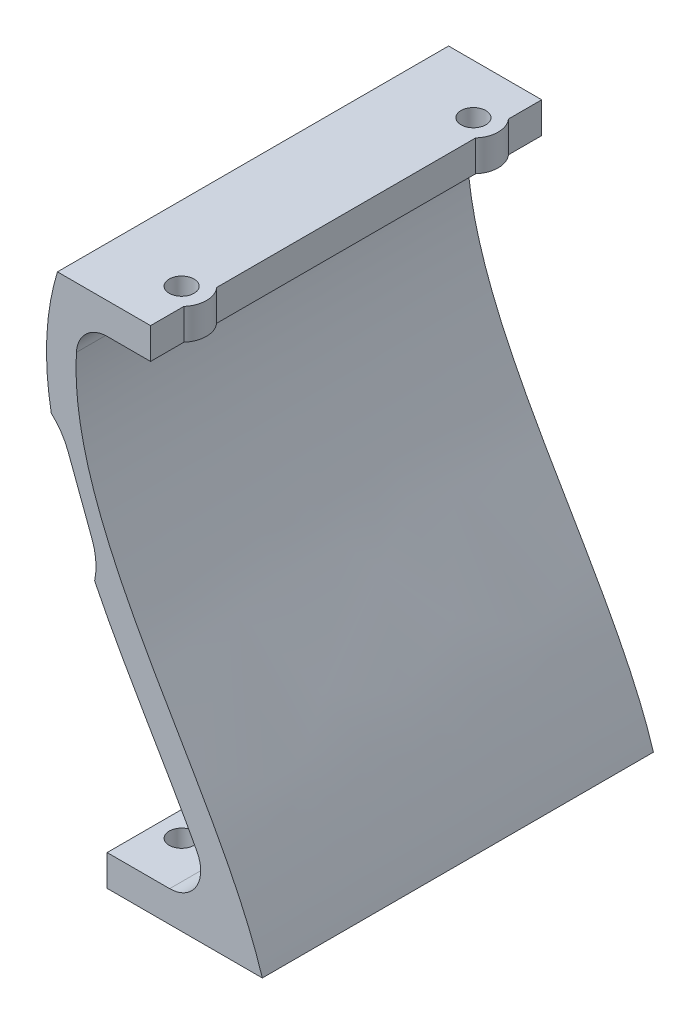
ISO-10303-21;
HEADER;
FILE_DESCRIPTION(('STEP AP214'),'2;1');
FILE_NAME('part.step','',(''),(''),'','','');
FILE_SCHEMA(('AUTOMOTIVE_DESIGN { 1 0 10303 214 1 1 1 1 }'));
ENDSEC;
DATA;
#1=APPLICATION_CONTEXT('core data for automotive mechanical design processes');
#2=APPLICATION_PROTOCOL_DEFINITION('international standard','automotive_design',2000,#1);
#3=PRODUCT_CONTEXT('',#1,'mechanical');
#4=PRODUCT('Part','Part','',(#3));
#5=PRODUCT_RELATED_PRODUCT_CATEGORY('part','',(#4));
#6=PRODUCT_DEFINITION_FORMATION('','',#4);
#7=PRODUCT_DEFINITION_CONTEXT('part definition',#1,'design');
#8=PRODUCT_DEFINITION('design','',#6,#7);
#9=PRODUCT_DEFINITION_SHAPE('','',#8);
#10=(LENGTH_UNIT() NAMED_UNIT(*) SI_UNIT(.MILLI.,.METRE.));
#11=(NAMED_UNIT(*) PLANE_ANGLE_UNIT() SI_UNIT($,.RADIAN.));
#12=(NAMED_UNIT(*) SI_UNIT($,.STERADIAN.) SOLID_ANGLE_UNIT());
#13=UNCERTAINTY_MEASURE_WITH_UNIT(LENGTH_MEASURE(1.E-05),#10,'distance_accuracy_value','');
#14=(GEOMETRIC_REPRESENTATION_CONTEXT(3) GLOBAL_UNCERTAINTY_ASSIGNED_CONTEXT((#13)) GLOBAL_UNIT_ASSIGNED_CONTEXT((#10,
#11,#12)) REPRESENTATION_CONTEXT('',''));
#15=CARTESIAN_POINT('',(0.,0.,0.));
#16=DIRECTION('',(0.,0.,1.));
#17=DIRECTION('',(1.,0.,0.));
#18=AXIS2_PLACEMENT_3D('',#15,#16,#17);
#19=CARTESIAN_POINT('',(-22.5334776197952,22.7570781612548,63.));
#20=CARTESIAN_POINT('',(-22.8802638174594,21.7643013859488,63.));
#21=CARTESIAN_POINT('',(-23.5022218297949,19.7353540922829,63.));
#22=CARTESIAN_POINT('',(-24.3984566732412,15.7227335791878,63.));
#23=CARTESIAN_POINT('',(-24.9259424602794,10.7154717202631,63.));
#24=CARTESIAN_POINT('',(-24.7059244457818,4.80639957244901,63.));
#25=CARTESIAN_POINT('',(-23.4437954980132,-2.90791828688786,63.));
#26=CARTESIAN_POINT('',(-20.3649701079,-12.2138739410152,63.));
#27=CARTESIAN_POINT('',(-15.1627192062184,-22.9267758821705,63.));
#28=CARTESIAN_POINT('',(-9.22446854976525,-33.2839412268649,63.));
#29=CARTESIAN_POINT('',(-4.2731817504284,-41.6523064711653,63.));
#30=CARTESIAN_POINT('',(-0.670405229165687,-48.1782991582584,63.));
#31=CARTESIAN_POINT('',(1.76514247549924,-52.980809675903,63.));
#32=CARTESIAN_POINT('',(3.49961876568494,-56.8892897902748,63.));
#33=CARTESIAN_POINT('',(4.67496429136453,-59.9655632013083,63.));
#34=CARTESIAN_POINT('',(5.17847746688474,-61.4613851443489,63.));
#35=CARTESIAN_POINT('',(5.41540171981831,-62.2227851308582,63.));
#36=B_SPLINE_CURVE_WITH_KNOTS('',3,(#19,#20,#21,#22,#23,#24,#25,#26,#27,#28,#29,#30,#31,#32,#33,
#34,#35),.UNSPECIFIED.,.F.,.F.,(4,1,1,1,1,1,1,1,1,1,1,1,1,1,4),(0.,0.03125,0.0625,0.125,0.1875,
0.25,0.375,0.5,0.625,0.75,0.8125,0.875,0.9375,0.96875,1.),.UNSPECIFIED.);
#37=DIRECTION('',(0.,0.,-1.));
#38=VECTOR('',#37,1.);
#39=SURFACE_OF_LINEAR_EXTRUSION('',#36,#38);
#40=CARTESIAN_POINT('',(-22.5334776197952,22.7570781612548,0.));
#41=CARTESIAN_POINT('',(-22.8802638174594,21.7643013859488,0.));
#42=CARTESIAN_POINT('',(-23.5022218297949,19.7353540922829,0.));
#43=CARTESIAN_POINT('',(-24.3984566732412,15.7227335791878,0.));
#44=CARTESIAN_POINT('',(-24.9259424602794,10.7154717202631,0.));
#45=CARTESIAN_POINT('',(-24.7059244457818,4.80639957244901,0.));
#46=CARTESIAN_POINT('',(-23.4437954980132,-2.90791828688786,0.));
#47=CARTESIAN_POINT('',(-20.3649701079,-12.2138739410152,0.));
#48=CARTESIAN_POINT('',(-15.1627192062184,-22.9267758821705,0.));
#49=CARTESIAN_POINT('',(-9.22446854976525,-33.2839412268649,0.));
#50=CARTESIAN_POINT('',(-4.2731817504284,-41.6523064711653,0.));
#51=CARTESIAN_POINT('',(-0.670405229165687,-48.1782991582584,0.));
#52=CARTESIAN_POINT('',(1.76514247549924,-52.980809675903,0.));
#53=CARTESIAN_POINT('',(3.49961876568494,-56.8892897902748,0.));
#54=CARTESIAN_POINT('',(4.67496429136453,-59.9655632013083,0.));
#55=CARTESIAN_POINT('',(5.17847746688474,-61.4613851443489,0.));
#56=CARTESIAN_POINT('',(5.41540171981831,-62.2227851308582,0.));
#57=B_SPLINE_CURVE_WITH_KNOTS('',3,(#40,#41,#42,#43,#44,#45,#46,#47,#48,#49,#50,#51,#52,#53,#54,
#55,#56),.UNSPECIFIED.,.F.,.F.,(4,1,1,1,1,1,1,1,1,1,1,1,1,1,4),(0.,0.03125,0.0625,0.125,0.1875,
0.25,0.375,0.5,0.625,0.75,0.8125,0.875,0.9375,0.96875,1.),.UNSPECIFIED.);
#58=CARTESIAN_POINT('',(-23.0458869966733,21.1895240179298,0.));
#59=VERTEX_POINT('',#58);
#60=CARTESIAN_POINT('',(-24.0422868679237,0.965333873783401,0.));
#61=VERTEX_POINT('',#60);
#62=EDGE_CURVE('E182',#59,#61,#57,.T.);
#63=ORIENTED_EDGE('',*,*,#62,.T.);
#64=DIRECTION('',(0.,0.,-1.));
#65=VECTOR('',#64,1.);
#66=CARTESIAN_POINT('',(-24.0422868687584,0.965333873300134,63.));
#67=LINE('',#66,#65);
#68=CARTESIAN_POINT('',(-24.0422868679237,0.965333873783399,63.));
#69=VERTEX_POINT('',#68);
#70=EDGE_CURVE('E174',#61,#69,#67,.F.);
#71=ORIENTED_EDGE('',*,*,#70,.T.);
#72=CARTESIAN_POINT('',(-23.0458869966733,21.1895240179298,63.));
#73=VERTEX_POINT('',#72);
#74=EDGE_CURVE('E219',#73,#69,#36,.T.);
#75=ORIENTED_EDGE('',*,*,#74,.F.);
#76=DIRECTION('',(0.,0.,-1.));
#77=VECTOR('',#76,1.);
#78=CARTESIAN_POINT('',(-23.0458869966733,21.1895240179298,63.));
#79=LINE('',#78,#77);
#80=EDGE_CURVE('E201',#73,#59,#79,.T.);
#81=ORIENTED_EDGE('',*,*,#80,.T.);
#82=EDGE_LOOP('',(#63,#71,#75,#81));
#83=FACE_BOUND('',#82,.T.);
#84=ADVANCED_FACE('F33',(#83),#39,.F.);
#85=CARTESIAN_POINT('',(-8.04588699669594,16.1895240178556,63.));
#86=DIRECTION('',(1.,0.,0.));
#87=DIRECTION('',(0.,0.,-1.));
#88=AXIS2_PLACEMENT_3D('',#85,#86,#87);
#89=PLANE('',#88);
#90=DIRECTION('',(0.,-1.,0.));
#91=VECTOR('',#90,1.);
#92=CARTESIAN_POINT('',(-8.04588699669594,21.1895240178556,10.6457513110646));
#93=LINE('',#92,#91);
#94=CARTESIAN_POINT('',(-8.04588699669594,21.1895240178556,10.6457513110646));
#95=VERTEX_POINT('',#94);
#96=CARTESIAN_POINT('',(-8.04588699669594,16.1895240178556,10.6457513110646));
#97=VERTEX_POINT('',#96);
#98=EDGE_CURVE('E291',#95,#97,#93,.T.);
#99=ORIENTED_EDGE('',*,*,#98,.F.);
#100=DIRECTION('',(0.,0.,-1.));
#101=VECTOR('',#100,1.);
#102=CARTESIAN_POINT('',(-8.04588699669594,21.1895240178556,63.));
#103=LINE('',#102,#101);
#104=CARTESIAN_POINT('',(-8.04588699669594,21.1895240178556,52.3542486889354));
#105=VERTEX_POINT('',#104);
#106=EDGE_CURVE('E265',#105,#95,#103,.T.);
#107=ORIENTED_EDGE('',*,*,#106,.F.);
#108=DIRECTION('',(0.,-1.,0.));
#109=VECTOR('',#108,1.);
#110=CARTESIAN_POINT('',(-8.04588699669594,21.1895240178556,52.3542486889354));
#111=LINE('',#110,#109);
#112=CARTESIAN_POINT('',(-8.04588699669594,16.1895240178556,52.3542486889354));
#113=VERTEX_POINT('',#112);
#114=EDGE_CURVE('E284',#113,#105,#111,.F.);
#115=ORIENTED_EDGE('',*,*,#114,.F.);
#116=DIRECTION('',(0.,0.,-1.));
#117=VECTOR('',#116,1.);
#118=CARTESIAN_POINT('',(-8.04588699669594,16.1895240178556,63.));
#119=LINE('',#118,#117);
#120=EDGE_CURVE('E268',#113,#97,#119,.T.);
#121=ORIENTED_EDGE('',*,*,#120,.T.);
#122=EDGE_LOOP('',(#99,#107,#115,#121));
#123=FACE_BOUND('',#122,.T.);
#124=ADVANCED_FACE('F415',(#123),#89,.T.);
#125=DIRECTION('',(0.,-1.,0.));
#126=VECTOR('',#125,1.);
#127=CARTESIAN_POINT('',(-8.04588699669594,21.1895240178556,57.6457513110646));
#128=LINE('',#127,#126);
#129=CARTESIAN_POINT('',(-8.04588699669594,21.1895240178556,57.6457513110646));
#130=VERTEX_POINT('',#129);
#131=CARTESIAN_POINT('',(-8.04588699669594,16.1895240178556,57.6457513110646));
#132=VERTEX_POINT('',#131);
#133=EDGE_CURVE('E279',#130,#132,#128,.T.);
#134=ORIENTED_EDGE('',*,*,#133,.F.);
#135=CARTESIAN_POINT('',(-8.04588699669594,21.1895240178556,63.));
#136=VERTEX_POINT('',#135);
#137=EDGE_CURVE('E261',#136,#130,#103,.T.);
#138=ORIENTED_EDGE('',*,*,#137,.F.);
#139=DIRECTION('',(0.,1.,0.));
#140=VECTOR('',#139,1.);
#141=CARTESIAN_POINT('',(-8.04588699669594,16.1895240178556,63.));
#142=LINE('',#141,#140);
#143=CARTESIAN_POINT('',(-8.04588699669594,16.1895240178556,63.));
#144=VERTEX_POINT('',#143);
#145=EDGE_CURVE('E249',#144,#136,#142,.T.);
#146=ORIENTED_EDGE('',*,*,#145,.F.);
#147=EDGE_CURVE('E257',#144,#132,#119,.T.);
#148=ORIENTED_EDGE('',*,*,#147,.T.);
#149=EDGE_LOOP('',(#134,#138,#146,#148));
#150=FACE_BOUND('',#149,.T.);
#151=ADVANCED_FACE('F241',(#150),#89,.T.);
#152=CARTESIAN_POINT('',(9.95411300330407,-60.8104759821444,63.));
#153=CARTESIAN_POINT('',(1.78782004145555,-34.5665002552168,63.));
#154=CARTESIAN_POINT('',(-27.9913048539535,-7.28206006884536,63.));
#155=CARTESIAN_POINT('',(-18.0458869966959,21.1895240178556,63.));
#156=B_SPLINE_CURVE_WITH_KNOTS('',3,(#152,#153,#154,#155),.UNSPECIFIED.,.F.,.F.,(4,4),(0.,1.),.UNSPECIFIED.);
#157=DIRECTION('',(0.,0.,-1.));
#158=VECTOR('',#157,1.);
#159=SURFACE_OF_LINEAR_EXTRUSION('',#156,#158);
#160=CARTESIAN_POINT('',(9.95411300330407,-60.8104759821444,0.));
#161=CARTESIAN_POINT('',(1.78782004145555,-34.5665002552168,0.));
#162=CARTESIAN_POINT('',(-27.9913048539535,-7.28206006884536,0.));
#163=CARTESIAN_POINT('',(-18.0458869966959,21.1895240178556,0.));
#164=B_SPLINE_CURVE_WITH_KNOTS('',3,(#160,#161,#162,#163),.UNSPECIFIED.,.F.,.F.,(4,4),(0.,1.),.UNSPECIFIED.);
#165=CARTESIAN_POINT('',(9.95411300330406,-60.8104759821444,0.));
#166=VERTEX_POINT('',#165);
#167=CARTESIAN_POINT('',(-19.9900394366485,11.486126685123,0.));
#168=VERTEX_POINT('',#167);
#169=EDGE_CURVE('E187',#166,#168,#164,.T.);
#170=ORIENTED_EDGE('',*,*,#169,.T.);
#171=DIRECTION('',(0.,0.,-1.));
#172=VECTOR('',#171,1.);
#173=CARTESIAN_POINT('',(-19.9900394366485,11.486126685123,0.));
#174=LINE('',#173,#172);
#175=CARTESIAN_POINT('',(-19.9900394366485,11.486126685123,63.));
#176=VERTEX_POINT('',#175);
#177=EDGE_CURVE('E205',#168,#176,#174,.F.);
#178=ORIENTED_EDGE('',*,*,#177,.T.);
#179=CARTESIAN_POINT('',(9.95411300330406,-60.8104759821444,63.));
#180=VERTEX_POINT('',#179);
#181=EDGE_CURVE('E197',#180,#176,#156,.T.);
#182=ORIENTED_EDGE('',*,*,#181,.F.);
#183=DIRECTION('',(0.,0.,-1.));
#184=VECTOR('',#183,1.);
#185=CARTESIAN_POINT('',(9.95411300330406,-60.8104759821444,63.));
#186=LINE('',#185,#184);
#187=EDGE_CURVE('E198',#180,#166,#186,.T.);
#188=ORIENTED_EDGE('',*,*,#187,.T.);
#189=EDGE_LOOP('',(#170,#178,#182,#188));
#190=FACE_BOUND('',#189,.T.);
#191=ADVANCED_FACE('F237',(#190),#159,.F.);
#192=CARTESIAN_POINT('',(-18.0458869966959,21.1895240178556,63.));
#193=DIRECTION('',(0.,-1.,0.));
#194=DIRECTION('',(0.,0.,-1.));
#195=AXIS2_PLACEMENT_3D('',#192,#193,#194);
#196=PLANE('',#195);
#197=ORIENTED_EDGE('',*,*,#106,.T.);
#198=CARTESIAN_POINT('',(-11.0458869966959,21.1895240178556,8.));
#199=DIRECTION('',(0.,-1.,0.));
#200=DIRECTION('',(1.,0.,0.));
#201=AXIS2_PLACEMENT_3D('',#198,#199,#200);
#202=CIRCLE('',#201,4.);
#203=CARTESIAN_POINT('',(-8.04588699669594,21.1895240178556,5.35424868893539));
#204=VERTEX_POINT('',#203);
#205=EDGE_CURVE('E299',#204,#95,#202,.T.);
#206=ORIENTED_EDGE('',*,*,#205,.F.);
#207=CARTESIAN_POINT('',(-8.04588699669594,21.1895240178556,0.));
#208=VERTEX_POINT('',#207);
#209=EDGE_CURVE('E266',#204,#208,#103,.T.);
#210=ORIENTED_EDGE('',*,*,#209,.T.);
#211=DIRECTION('',(-1.,0.,0.));
#212=VECTOR('',#211,1.);
#213=CARTESIAN_POINT('',(-18.0458869966959,21.1895240178556,0.));
#214=LINE('',#213,#212);
#215=EDGE_CURVE('E183',#208,#59,#214,.T.);
#216=ORIENTED_EDGE('',*,*,#215,.T.);
#217=ORIENTED_EDGE('',*,*,#80,.F.);
#218=DIRECTION('',(-1.,0.,0.));
#219=VECTOR('',#218,1.);
#220=CARTESIAN_POINT('',(-18.0458869966959,21.1895240178556,63.));
#221=LINE('',#220,#219);
#222=EDGE_CURVE('E224',#136,#73,#221,.T.);
#223=ORIENTED_EDGE('',*,*,#222,.F.);
#224=ORIENTED_EDGE('',*,*,#137,.T.);
#225=CARTESIAN_POINT('',(-11.0458869966959,21.1895240178556,55.));
#226=DIRECTION('',(0.,-1.,0.));
#227=DIRECTION('',(1.,0.,0.));
#228=AXIS2_PLACEMENT_3D('',#225,#226,#227);
#229=CIRCLE('',#228,4.);
#230=EDGE_CURVE('E287',#105,#130,#229,.T.);
#231=ORIENTED_EDGE('',*,*,#230,.F.);
#232=EDGE_LOOP('',(#197,#206,#210,#216,#217,#223,#224,#231));
#233=FACE_BOUND('',#232,.T.);
#234=CARTESIAN_POINT('',(-11.0458869966959,21.1895240178556,55.));
#235=DIRECTION('',(0.,-1.,0.));
#236=DIRECTION('',(0.,0.,-1.));
#237=AXIS2_PLACEMENT_3D('',#234,#235,#236);
#238=CIRCLE('',#237,2.);
#239=CARTESIAN_POINT('',(-11.0458869966959,21.1895240178556,53.));
#240=VERTEX_POINT('',#239);
#241=EDGE_CURVE('E272',#240,#240,#238,.T.);
#242=ORIENTED_EDGE('',*,*,#241,.T.);
#243=EDGE_LOOP('',(#242));
#244=FACE_BOUND('',#243,.T.);
#245=CARTESIAN_POINT('',(-11.0458869966959,21.1895240178556,8.));
#246=DIRECTION('',(0.,-1.,0.));
#247=DIRECTION('',(0.,0.,-1.));
#248=AXIS2_PLACEMENT_3D('',#245,#246,#247);
#249=CIRCLE('',#248,2.);
#250=CARTESIAN_POINT('',(-11.0458869966959,21.1895240178556,6.));
#251=VERTEX_POINT('',#250);
#252=EDGE_CURVE('E269',#251,#251,#249,.T.);
#253=ORIENTED_EDGE('',*,*,#252,.T.);
#254=EDGE_LOOP('',(#253));
#255=FACE_BOUND('',#254,.T.);
#256=ADVANCED_FACE('F233',(#233,#244,#255),#196,.F.);
#257=CARTESIAN_POINT('',(-17.056649455873,-18.9189032047106,63.));
#258=VERTEX_POINT('',#257);
#259=CARTESIAN_POINT('',(-0.547367076397627,-48.4799277852592,63.));
#260=VERTEX_POINT('',#259);
#261=EDGE_CURVE('E173',#258,#260,#36,.T.);
#262=ORIENTED_EDGE('',*,*,#261,.F.);
#263=DIRECTION('',(0.,0.,-1.));
#264=VECTOR('',#263,1.);
#265=CARTESIAN_POINT('',(-17.0566494558731,-18.9189032047107,63.));
#266=LINE('',#265,#264);
#267=CARTESIAN_POINT('',(-17.056649455873,-18.9189032047106,0.));
#268=VERTEX_POINT('',#267);
#269=EDGE_CURVE('E161',#258,#268,#266,.T.);
#270=ORIENTED_EDGE('',*,*,#269,.T.);
#271=CARTESIAN_POINT('',(-0.547367076397627,-48.4799277852592,0.));
#272=VERTEX_POINT('',#271);
#273=EDGE_CURVE('E171',#268,#272,#57,.T.);
#274=ORIENTED_EDGE('',*,*,#273,.T.);
#275=DIRECTION('',(0.,0.,-1.));
#276=VECTOR('',#275,1.);
#277=CARTESIAN_POINT('',(-0.547367076397627,-48.4799277852592,0.));
#278=LINE('',#277,#276);
#279=EDGE_CURVE('E364',#272,#260,#278,.F.);
#280=ORIENTED_EDGE('',*,*,#279,.T.);
#281=EDGE_LOOP('',(#262,#270,#274,#280));
#282=FACE_BOUND('',#281,.T.);
#283=ADVANCED_FACE('F169',(#282),#39,.F.);
#284=CARTESIAN_POINT('',(9.95411300330406,-60.8104759821444,63.));
#285=DIRECTION('',(0.,1.,0.));
#286=DIRECTION('',(0.,0.,1.));
#287=AXIS2_PLACEMENT_3D('',#284,#285,#286);
#288=PLANE('',#287);
#289=CARTESIAN_POINT('',(-11.045886996696,-60.8104759821444,54.9999999999997));
#290=DIRECTION('',(0.,1.,0.));
#291=DIRECTION('',(0.,0.,1.));
#292=AXIS2_PLACEMENT_3D('',#289,#290,#291);
#293=CIRCLE('',#292,1.99999999999999);
#294=CARTESIAN_POINT('',(-11.045886996696,-60.8104759821444,56.9999999999997));
#295=VERTEX_POINT('',#294);
#296=EDGE_CURVE('E316',#295,#295,#293,.T.);
#297=ORIENTED_EDGE('',*,*,#296,.T.);
#298=EDGE_LOOP('',(#297));
#299=FACE_BOUND('',#298,.T.);
#300=CARTESIAN_POINT('',(-11.045886996696,-60.8104759821444,8.00000000000028));
#301=DIRECTION('',(0.,1.,0.));
#302=DIRECTION('',(0.,0.,-1.));
#303=AXIS2_PLACEMENT_3D('',#300,#301,#302);
#304=CIRCLE('',#303,1.99999999999999);
#305=CARTESIAN_POINT('',(-11.045886996696,-60.8104759821444,6.00000000000029));
#306=VERTEX_POINT('',#305);
#307=EDGE_CURVE('E325',#306,#306,#304,.T.);
#308=ORIENTED_EDGE('',*,*,#307,.T.);
#309=EDGE_LOOP('',(#308));
#310=FACE_BOUND('',#309,.T.);
#311=DIRECTION('',(1.,0.,0.));
#312=VECTOR('',#311,1.);
#313=CARTESIAN_POINT('',(9.95411300330406,-60.8104759821444,0.));
#314=LINE('',#313,#312);
#315=CARTESIAN_POINT('',(-15.0458869966959,-60.8104759821444,0.));
#316=VERTEX_POINT('',#315);
#317=EDGE_CURVE('E186',#316,#166,#314,.T.);
#318=ORIENTED_EDGE('',*,*,#317,.T.);
#319=ORIENTED_EDGE('',*,*,#187,.F.);
#320=DIRECTION('',(1.,0.,0.));
#321=VECTOR('',#320,1.);
#322=CARTESIAN_POINT('',(9.95411300330406,-60.8104759821444,63.));
#323=LINE('',#322,#321);
#324=CARTESIAN_POINT('',(-15.0458869966959,-60.8104759821444,63.));
#325=VERTEX_POINT('',#324);
#326=EDGE_CURVE('E202',#325,#180,#323,.T.);
#327=ORIENTED_EDGE('',*,*,#326,.F.);
#328=DIRECTION('',(0.,0.,-1.));
#329=VECTOR('',#328,1.);
#330=CARTESIAN_POINT('',(-15.0458869966959,-60.8104759821444,63.));
#331=LINE('',#330,#329);
#332=EDGE_CURVE('E312',#325,#316,#331,.T.);
#333=ORIENTED_EDGE('',*,*,#332,.T.);
#334=EDGE_LOOP('',(#318,#319,#327,#333));
#335=FACE_BOUND('',#334,.T.);
#336=ADVANCED_FACE('F232',(#299,#310,#335),#288,.F.);
#337=CARTESIAN_POINT('',(-10.8377785538607,-20.6458291170594,63.));
#338=DIRECTION('',(0.,0.,-1.));
#339=DIRECTION('',(-1.,0.,0.));
#340=AXIS2_PLACEMENT_3D('',#337,#338,#339);
#341=PLANE('',#340);
#342=ORIENTED_EDGE('',*,*,#74,.T.);
#343=CARTESIAN_POINT('',(-30.7117135089127,-6.48575653627084,63.));
#344=DIRECTION('',(0.,0.,-1.));
#345=DIRECTION('',(-1.,0.,0.));
#346=AXIS2_PLACEMENT_3D('',#343,#344,#345);
#347=CIRCLE('',#346,10.);
#348=CARTESIAN_POINT('',(-21.3509324975584,-2.96783401616487,63.));
#349=VERTEX_POINT('',#348);
#350=EDGE_CURVE('E11',#69,#349,#347,.T.);
#351=ORIENTED_EDGE('',*,*,#350,.T.);
#352=DIRECTION('',(0.351792252010596,-0.936078101135431,0.));
#353=VECTOR('',#352,1.);
#354=CARTESIAN_POINT('',(-14.2283952267174,-21.9200739408643,63.));
#355=LINE('',#354,#353);
#356=CARTESIAN_POINT('',(-17.4709513508528,-13.2920107525531,63.));
#357=VERTEX_POINT('',#356);
#358=EDGE_CURVE('E326',#349,#357,#355,.T.);
#359=ORIENTED_EDGE('',*,*,#358,.T.);
#360=CARTESIAN_POINT('',(-26.8317323622071,-16.8099332726591,63.));
#361=DIRECTION('',(0.,0.,-1.));
#362=DIRECTION('',(-1.,0.,0.));
#363=AXIS2_PLACEMENT_3D('',#360,#361,#362);
#364=CIRCLE('',#363,10.);
#365=EDGE_CURVE('E165',#357,#258,#364,.T.);
#366=ORIENTED_EDGE('',*,*,#365,.T.);
#367=ORIENTED_EDGE('',*,*,#261,.T.);
#368=CARTESIAN_POINT('',(-4.97100190558444,-50.8104759821445,63.));
#369=DIRECTION('',(0.,0.,-1.));
#370=DIRECTION('',(-1.,0.,0.));
#371=AXIS2_PLACEMENT_3D('',#368,#369,#370);
#372=CIRCLE('',#371,5.);
#373=CARTESIAN_POINT('',(-4.97100190558444,-55.8104759821444,63.));
#374=VERTEX_POINT('',#373);
#375=EDGE_CURVE('E354',#260,#374,#372,.T.);
#376=ORIENTED_EDGE('',*,*,#375,.T.);
#377=DIRECTION('',(-1.,0.,0.));
#378=VECTOR('',#377,1.);
#379=CARTESIAN_POINT('',(4.95411300330406,-55.8104759821444,63.));
#380=LINE('',#379,#378);
#381=CARTESIAN_POINT('',(-15.0458869966959,-55.8104759821444,63.));
#382=VERTEX_POINT('',#381);
#383=EDGE_CURVE('E315',#374,#382,#380,.T.);
#384=ORIENTED_EDGE('',*,*,#383,.T.);
#385=DIRECTION('',(0.,-1.,0.));
#386=VECTOR('',#385,1.);
#387=CARTESIAN_POINT('',(-15.0458869966959,-55.8104759821444,63.));
#388=LINE('',#387,#386);
#389=EDGE_CURVE('E306',#382,#325,#388,.T.);
#390=ORIENTED_EDGE('',*,*,#389,.T.);
#391=ORIENTED_EDGE('',*,*,#326,.T.);
#392=ORIENTED_EDGE('',*,*,#181,.T.);
#393=CARTESIAN_POINT('',(-14.9988445037922,11.1895240178556,63.));
#394=DIRECTION('',(0.,0.,-1.));
#395=DIRECTION('',(-1.,0.,0.));
#396=AXIS2_PLACEMENT_3D('',#393,#394,#395);
#397=CIRCLE('',#396,5.);
#398=CARTESIAN_POINT('',(-14.9988445037922,16.1895240178556,63.));
#399=VERTEX_POINT('',#398);
#400=EDGE_CURVE('E369',#176,#399,#397,.T.);
#401=ORIENTED_EDGE('',*,*,#400,.T.);
#402=DIRECTION('',(1.,0.,0.));
#403=VECTOR('',#402,1.);
#404=CARTESIAN_POINT('',(-18.0458869966959,16.1895240178556,63.));
#405=LINE('',#404,#403);
#406=EDGE_CURVE('E260',#399,#144,#405,.T.);
#407=ORIENTED_EDGE('',*,*,#406,.T.);
#408=ORIENTED_EDGE('',*,*,#145,.T.);
#409=ORIENTED_EDGE('',*,*,#222,.T.);
#410=EDGE_LOOP('',(#342,#351,#359,#366,#367,#376,#384,#390,#391,#392,#401,#407,#408,#409));
#411=FACE_BOUND('',#410,.T.);
#412=ADVANCED_FACE('F358',(#411),#341,.F.);
#413=CARTESIAN_POINT('',(-10.8377785538607,-20.6458291170594,0.));
#414=DIRECTION('',(0.,0.,-1.));
#415=DIRECTION('',(-1.,0.,0.));
#416=AXIS2_PLACEMENT_3D('',#413,#414,#415);
#417=PLANE('',#416);
#418=CARTESIAN_POINT('',(-23.0458869966733,1.54224197321388,0.));
#419=CARTESIAN_POINT('',(-15.527464839307,-18.4634014040314,0.));
#420=B_SPLINE_CURVE_WITH_KNOTS('',1,(#418,#419),.UNSPECIFIED.,.F.,.F.,(2,2),(0.,1.),.UNSPECIFIED.);
#421=CARTESIAN_POINT('',(-21.3509324975584,-2.96783401616488,0.));
#422=VERTEX_POINT('',#421);
#423=CARTESIAN_POINT('',(-17.4709513508528,-13.2920107525531,0.));
#424=VERTEX_POINT('',#423);
#425=EDGE_CURVE('E175',#422,#424,#420,.T.);
#426=ORIENTED_EDGE('',*,*,#425,.F.);
#427=CARTESIAN_POINT('',(-30.7117135089127,-6.48575653627084,0.));
#428=DIRECTION('',(0.,0.,-1.));
#429=DIRECTION('',(-1.,0.,0.));
#430=AXIS2_PLACEMENT_3D('',#427,#428,#429);
#431=CIRCLE('',#430,10.);
#432=EDGE_CURVE('E41',#422,#61,#431,.F.);
#433=ORIENTED_EDGE('',*,*,#432,.T.);
#434=ORIENTED_EDGE('',*,*,#62,.F.);
#435=ORIENTED_EDGE('',*,*,#215,.F.);
#436=DIRECTION('',(0.,1.,0.));
#437=VECTOR('',#436,1.);
#438=CARTESIAN_POINT('',(-8.04588699669594,16.1895240178556,0.));
#439=LINE('',#438,#437);
#440=CARTESIAN_POINT('',(-8.04588699669594,16.1895240178556,0.));
#441=VERTEX_POINT('',#440);
#442=EDGE_CURVE('E256',#441,#208,#439,.T.);
#443=ORIENTED_EDGE('',*,*,#442,.F.);
#444=DIRECTION('',(1.,0.,0.));
#445=VECTOR('',#444,1.);
#446=CARTESIAN_POINT('',(-18.0458869966959,16.1895240178556,0.));
#447=LINE('',#446,#445);
#448=CARTESIAN_POINT('',(-14.9988445037922,16.1895240178556,0.));
#449=VERTEX_POINT('',#448);
#450=EDGE_CURVE('E208',#449,#441,#447,.T.);
#451=ORIENTED_EDGE('',*,*,#450,.F.);
#452=CARTESIAN_POINT('',(-14.9988445037922,11.1895240178556,0.));
#453=DIRECTION('',(0.,0.,-1.));
#454=DIRECTION('',(-1.,0.,0.));
#455=AXIS2_PLACEMENT_3D('',#452,#453,#454);
#456=CIRCLE('',#455,5.);
#457=EDGE_CURVE('E366',#449,#168,#456,.F.);
#458=ORIENTED_EDGE('',*,*,#457,.T.);
#459=ORIENTED_EDGE('',*,*,#169,.F.);
#460=ORIENTED_EDGE('',*,*,#317,.F.);
#461=DIRECTION('',(0.,-1.,0.));
#462=VECTOR('',#461,1.);
#463=CARTESIAN_POINT('',(-15.0458869966959,-55.8104759821444,0.));
#464=LINE('',#463,#462);
#465=CARTESIAN_POINT('',(-15.0458869966959,-55.8104759821444,0.));
#466=VERTEX_POINT('',#465);
#467=EDGE_CURVE('E303',#466,#316,#464,.T.);
#468=ORIENTED_EDGE('',*,*,#467,.F.);
#469=DIRECTION('',(1.,0.,0.));
#470=VECTOR('',#469,1.);
#471=CARTESIAN_POINT('',(4.95411300330406,-55.8104759821444,0.));
#472=LINE('',#471,#470);
#473=CARTESIAN_POINT('',(-4.97100190558444,-55.8104759821444,0.));
#474=VERTEX_POINT('',#473);
#475=EDGE_CURVE('E309',#466,#474,#472,.T.);
#476=ORIENTED_EDGE('',*,*,#475,.T.);
#477=CARTESIAN_POINT('',(-4.97100190558444,-50.8104759821445,0.));
#478=DIRECTION('',(0.,0.,-1.));
#479=DIRECTION('',(-1.,0.,0.));
#480=AXIS2_PLACEMENT_3D('',#477,#478,#479);
#481=CIRCLE('',#480,5.);
#482=EDGE_CURVE('E180',#474,#272,#481,.F.);
#483=ORIENTED_EDGE('',*,*,#482,.T.);
#484=ORIENTED_EDGE('',*,*,#273,.F.);
#485=CARTESIAN_POINT('',(-26.8317323622071,-16.8099332726591,0.));
#486=DIRECTION('',(0.,0.,-1.));
#487=DIRECTION('',(-1.,0.,0.));
#488=AXIS2_PLACEMENT_3D('',#485,#486,#487);
#489=CIRCLE('',#488,10.);
#490=EDGE_CURVE('E157',#268,#424,#489,.F.);
#491=ORIENTED_EDGE('',*,*,#490,.T.);
#492=EDGE_LOOP('',(#426,#433,#434,#435,#443,#451,#458,#459,#460,#468,#476,#483,#484,#491));
#493=FACE_BOUND('',#492,.T.);
#494=ADVANCED_FACE('F177',(#493),#417,.T.);
#495=CARTESIAN_POINT('',(-18.0458869966959,16.1895240178556,-5.17978739319327));
#496=DIRECTION('',(0.,-1.,0.));
#497=DIRECTION('',(1.,0.,0.));
#498=AXIS2_PLACEMENT_3D('',#495,#496,#497);
#499=PLANE('',#498);
#500=CARTESIAN_POINT('',(-8.04588699669594,16.1895240178556,5.35424868893541));
#501=VERTEX_POINT('',#500);
#502=EDGE_CURVE('E264',#501,#441,#119,.T.);
#503=ORIENTED_EDGE('',*,*,#502,.F.);
#504=CARTESIAN_POINT('',(-11.0458869966959,16.1895240178556,8.));
#505=DIRECTION('',(0.,-1.,0.));
#506=DIRECTION('',(1.,0.,0.));
#507=AXIS2_PLACEMENT_3D('',#504,#505,#506);
#508=CIRCLE('',#507,4.);
#509=EDGE_CURVE('E300',#501,#97,#508,.T.);
#510=ORIENTED_EDGE('',*,*,#509,.T.);
#511=ORIENTED_EDGE('',*,*,#120,.F.);
#512=CARTESIAN_POINT('',(-11.0458869966959,16.1895240178556,55.));
#513=DIRECTION('',(0.,-1.,0.));
#514=DIRECTION('',(1.,0.,0.));
#515=AXIS2_PLACEMENT_3D('',#512,#513,#514);
#516=CIRCLE('',#515,4.);
#517=EDGE_CURVE('E288',#113,#132,#516,.T.);
#518=ORIENTED_EDGE('',*,*,#517,.T.);
#519=ORIENTED_EDGE('',*,*,#147,.F.);
#520=ORIENTED_EDGE('',*,*,#406,.F.);
#521=DIRECTION('',(0.,0.,-1.));
#522=VECTOR('',#521,1.);
#523=CARTESIAN_POINT('',(-14.9988445037922,16.1895240178556,-5.17978739319327));
#524=LINE('',#523,#522);
#525=EDGE_CURVE('E373',#399,#449,#524,.T.);
#526=ORIENTED_EDGE('',*,*,#525,.T.);
#527=ORIENTED_EDGE('',*,*,#450,.T.);
#528=EDGE_LOOP('',(#503,#510,#511,#518,#519,#520,#526,#527));
#529=FACE_BOUND('',#528,.T.);
#530=CARTESIAN_POINT('',(-11.0458869966959,16.1895240178556,8.));
#531=DIRECTION('',(0.,-1.,0.));
#532=DIRECTION('',(1.,0.,0.));
#533=AXIS2_PLACEMENT_3D('',#530,#531,#532);
#534=CIRCLE('',#533,2.);
#535=CARTESIAN_POINT('',(-9.04588699669594,16.1895240178556,8.));
#536=VERTEX_POINT('',#535);
#537=EDGE_CURVE('E275',#536,#536,#534,.T.);
#538=ORIENTED_EDGE('',*,*,#537,.F.);
#539=EDGE_LOOP('',(#538));
#540=FACE_BOUND('',#539,.T.);
#541=CARTESIAN_POINT('',(-11.0458869966959,16.1895240178556,55.));
#542=DIRECTION('',(0.,-1.,0.));
#543=DIRECTION('',(1.,0.,0.));
#544=AXIS2_PLACEMENT_3D('',#541,#542,#543);
#545=CIRCLE('',#544,2.);
#546=CARTESIAN_POINT('',(-9.04588699669594,16.1895240178556,55.));
#547=VERTEX_POINT('',#546);
#548=EDGE_CURVE('E276',#547,#547,#545,.T.);
#549=ORIENTED_EDGE('',*,*,#548,.F.);
#550=EDGE_LOOP('',(#549));
#551=FACE_BOUND('',#550,.T.);
#552=ADVANCED_FACE('F402',(#529,#540,#551),#499,.T.);
#553=DIRECTION('',(0.,-1.,0.));
#554=VECTOR('',#553,1.);
#555=CARTESIAN_POINT('',(-8.04588699669594,21.1895240178556,5.35424868893539));
#556=LINE('',#555,#554);
#557=EDGE_CURVE('E296',#501,#204,#556,.F.);
#558=ORIENTED_EDGE('',*,*,#557,.F.);
#559=ORIENTED_EDGE('',*,*,#502,.T.);
#560=ORIENTED_EDGE('',*,*,#442,.T.);
#561=ORIENTED_EDGE('',*,*,#209,.F.);
#562=EDGE_LOOP('',(#558,#559,#560,#561));
#563=FACE_BOUND('',#562,.T.);
#564=ADVANCED_FACE('F398',(#563),#89,.T.);
#565=CARTESIAN_POINT('',(-14.9988445037922,11.1895240178556,31.5));
#566=DIRECTION('',(0.,0.,-1.));
#567=DIRECTION('',(-1.,0.,0.));
#568=AXIS2_PLACEMENT_3D('',#565,#566,#567);
#569=CYLINDRICAL_SURFACE('',#568,5.);
#570=ORIENTED_EDGE('',*,*,#457,.F.);
#571=ORIENTED_EDGE('',*,*,#525,.F.);
#572=ORIENTED_EDGE('',*,*,#400,.F.);
#573=ORIENTED_EDGE('',*,*,#177,.F.);
#574=EDGE_LOOP('',(#570,#571,#572,#573));
#575=FACE_BOUND('',#574,.T.);
#576=ADVANCED_FACE('F243',(#575),#569,.F.);
#577=CARTESIAN_POINT('',(-11.0458869966959,26.1895240178556,55.));
#578=DIRECTION('',(0.,-1.,0.));
#579=DIRECTION('',(1.,0.,0.));
#580=AXIS2_PLACEMENT_3D('',#577,#578,#579);
#581=CYLINDRICAL_SURFACE('',#580,2.);
#582=ORIENTED_EDGE('',*,*,#548,.T.);
#583=EDGE_LOOP('',(#582));
#584=FACE_BOUND('',#583,.T.);
#585=ORIENTED_EDGE('',*,*,#241,.F.);
#586=EDGE_LOOP('',(#585));
#587=FACE_BOUND('',#586,.T.);
#588=ADVANCED_FACE('F406',(#584,#587),#581,.F.);
#589=CARTESIAN_POINT('',(-11.0458869966959,26.1895240178556,8.));
#590=DIRECTION('',(0.,-1.,0.));
#591=DIRECTION('',(1.,0.,0.));
#592=AXIS2_PLACEMENT_3D('',#589,#590,#591);
#593=CYLINDRICAL_SURFACE('',#592,2.);
#594=ORIENTED_EDGE('',*,*,#537,.T.);
#595=EDGE_LOOP('',(#594));
#596=FACE_BOUND('',#595,.T.);
#597=ORIENTED_EDGE('',*,*,#252,.F.);
#598=EDGE_LOOP('',(#597));
#599=FACE_BOUND('',#598,.T.);
#600=ADVANCED_FACE('F411',(#596,#599),#593,.F.);
#601=CARTESIAN_POINT('',(-11.0458869966959,21.1895240178556,55.));
#602=DIRECTION('',(0.,-1.,0.));
#603=DIRECTION('',(1.,0.,0.));
#604=AXIS2_PLACEMENT_3D('',#601,#602,#603);
#605=CYLINDRICAL_SURFACE('',#604,4.);
#606=ORIENTED_EDGE('',*,*,#230,.T.);
#607=ORIENTED_EDGE('',*,*,#133,.T.);
#608=ORIENTED_EDGE('',*,*,#517,.F.);
#609=ORIENTED_EDGE('',*,*,#114,.T.);
#610=EDGE_LOOP('',(#606,#607,#608,#609));
#611=FACE_BOUND('',#610,.T.);
#612=ADVANCED_FACE('F485',(#611),#605,.T.);
#613=CARTESIAN_POINT('',(-11.0458869966959,21.1895240178556,8.));
#614=DIRECTION('',(0.,-1.,0.));
#615=DIRECTION('',(1.,0.,0.));
#616=AXIS2_PLACEMENT_3D('',#613,#614,#615);
#617=CYLINDRICAL_SURFACE('',#616,4.);
#618=ORIENTED_EDGE('',*,*,#205,.T.);
#619=ORIENTED_EDGE('',*,*,#98,.T.);
#620=ORIENTED_EDGE('',*,*,#509,.F.);
#621=ORIENTED_EDGE('',*,*,#557,.T.);
#622=EDGE_LOOP('',(#618,#619,#620,#621));
#623=FACE_BOUND('',#622,.T.);
#624=ADVANCED_FACE('F478',(#623),#617,.T.);
#625=CARTESIAN_POINT('',(0.,-55.8104759821444,0.));
#626=DIRECTION('',(0.,1.,0.));
#627=DIRECTION('',(0.,0.,1.));
#628=AXIS2_PLACEMENT_3D('',#625,#626,#627);
#629=PLANE('',#628);
#630=CARTESIAN_POINT('',(-11.045886996696,-55.8104759821444,54.9999999999997));
#631=DIRECTION('',(0.,1.,0.));
#632=DIRECTION('',(0.,0.,1.));
#633=AXIS2_PLACEMENT_3D('',#630,#631,#632);
#634=CIRCLE('',#633,1.99999999999999);
#635=CARTESIAN_POINT('',(-11.045886996696,-55.8104759821444,56.9999999999997));
#636=VERTEX_POINT('',#635);
#637=EDGE_CURVE('E329',#636,#636,#634,.T.);
#638=ORIENTED_EDGE('',*,*,#637,.F.);
#639=EDGE_LOOP('',(#638));
#640=FACE_BOUND('',#639,.T.);
#641=CARTESIAN_POINT('',(-11.045886996696,-55.8104759821444,8.00000000000028));
#642=DIRECTION('',(0.,1.,0.));
#643=DIRECTION('',(0.,0.,-1.));
#644=AXIS2_PLACEMENT_3D('',#641,#642,#643);
#645=CIRCLE('',#644,1.99999999999999);
#646=CARTESIAN_POINT('',(-11.045886996696,-55.8104759821444,6.00000000000029));
#647=VERTEX_POINT('',#646);
#648=EDGE_CURVE('E322',#647,#647,#645,.T.);
#649=ORIENTED_EDGE('',*,*,#648,.F.);
#650=EDGE_LOOP('',(#649));
#651=FACE_BOUND('',#650,.T.);
#652=ORIENTED_EDGE('',*,*,#383,.F.);
#653=DIRECTION('',(0.,0.,-1.));
#654=VECTOR('',#653,1.);
#655=CARTESIAN_POINT('',(-4.97100190558444,-55.8104759821444,0.));
#656=LINE('',#655,#654);
#657=EDGE_CURVE('E365',#374,#474,#656,.T.);
#658=ORIENTED_EDGE('',*,*,#657,.T.);
#659=ORIENTED_EDGE('',*,*,#475,.F.);
#660=DIRECTION('',(0.,0.,-1.));
#661=VECTOR('',#660,1.);
#662=CARTESIAN_POINT('',(-15.0458869966959,-55.8104759821444,63.));
#663=LINE('',#662,#661);
#664=EDGE_CURVE('E318',#382,#466,#663,.T.);
#665=ORIENTED_EDGE('',*,*,#664,.F.);
#666=EDGE_LOOP('',(#652,#658,#659,#665));
#667=FACE_BOUND('',#666,.T.);
#668=ADVANCED_FACE('F471',(#640,#651,#667),#629,.T.);
#669=CARTESIAN_POINT('',(-15.0458869966959,-55.8104759821444,63.));
#670=DIRECTION('',(-1.,0.,0.));
#671=DIRECTION('',(0.,0.,1.));
#672=AXIS2_PLACEMENT_3D('',#669,#670,#671);
#673=PLANE('',#672);
#674=ORIENTED_EDGE('',*,*,#332,.F.);
#675=ORIENTED_EDGE('',*,*,#389,.F.);
#676=ORIENTED_EDGE('',*,*,#664,.T.);
#677=ORIENTED_EDGE('',*,*,#467,.T.);
#678=EDGE_LOOP('',(#674,#675,#676,#677));
#679=FACE_BOUND('',#678,.T.);
#680=ADVANCED_FACE('F464',(#679),#673,.T.);
#681=CARTESIAN_POINT('',(-4.97100190558444,-50.8104759821445,31.5));
#682=DIRECTION('',(0.,0.,-1.));
#683=DIRECTION('',(-1.,0.,0.));
#684=AXIS2_PLACEMENT_3D('',#681,#682,#683);
#685=CYLINDRICAL_SURFACE('',#684,5.);
#686=ORIENTED_EDGE('',*,*,#482,.F.);
#687=ORIENTED_EDGE('',*,*,#657,.F.);
#688=ORIENTED_EDGE('',*,*,#375,.F.);
#689=ORIENTED_EDGE('',*,*,#279,.F.);
#690=EDGE_LOOP('',(#686,#687,#688,#689));
#691=FACE_BOUND('',#690,.T.);
#692=ADVANCED_FACE('F363',(#691),#685,.F.);
#693=CARTESIAN_POINT('',(-11.045886996696,-60.8104759821444,8.00000000000028));
#694=DIRECTION('',(0.,1.,0.));
#695=DIRECTION('',(0.,0.,1.));
#696=AXIS2_PLACEMENT_3D('',#693,#694,#695);
#697=CYLINDRICAL_SURFACE('',#696,1.99999999999999);
#698=ORIENTED_EDGE('',*,*,#307,.F.);
#699=EDGE_LOOP('',(#698));
#700=FACE_BOUND('',#699,.T.);
#701=ORIENTED_EDGE('',*,*,#648,.T.);
#702=EDGE_LOOP('',(#701));
#703=FACE_BOUND('',#702,.T.);
#704=ADVANCED_FACE('F463',(#700,#703),#697,.F.);
#705=CARTESIAN_POINT('',(-11.045886996696,-60.8104759821444,54.9999999999997));
#706=DIRECTION('',(0.,1.,0.));
#707=DIRECTION('',(0.,0.,1.));
#708=AXIS2_PLACEMENT_3D('',#705,#706,#707);
#709=CYLINDRICAL_SURFACE('',#708,1.99999999999999);
#710=ORIENTED_EDGE('',*,*,#296,.F.);
#711=EDGE_LOOP('',(#710));
#712=FACE_BOUND('',#711,.T.);
#713=ORIENTED_EDGE('',*,*,#637,.T.);
#714=EDGE_LOOP('',(#713));
#715=FACE_BOUND('',#714,.T.);
#716=ADVANCED_FACE('F443',(#712,#715),#709,.F.);
#717=CARTESIAN_POINT('',(-23.0458869966733,1.54224197321388,80.));
#718=DIRECTION('',(0.93607810113543,0.351792252010596,0.));
#719=DIRECTION('',(-0.351792252010596,0.936078101135431,0.));
#720=AXIS2_PLACEMENT_3D('',#717,#718,#719);
#721=PLANE('',#720);
#722=ORIENTED_EDGE('',*,*,#425,.T.);
#723=DIRECTION('',(0.,0.,-1.));
#724=VECTOR('',#723,1.);
#725=CARTESIAN_POINT('',(-17.4709513508528,-13.2920107525531,80.));
#726=LINE('',#725,#724);
#727=EDGE_CURVE('E48',#424,#357,#726,.F.);
#728=ORIENTED_EDGE('',*,*,#727,.T.);
#729=ORIENTED_EDGE('',*,*,#358,.F.);
#730=DIRECTION('',(0.,0.,-1.));
#731=VECTOR('',#730,1.);
#732=CARTESIAN_POINT('',(-21.3509324975584,-2.96783401616488,80.));
#733=LINE('',#732,#731);
#734=EDGE_CURVE('E344',#349,#422,#733,.T.);
#735=ORIENTED_EDGE('',*,*,#734,.T.);
#736=EDGE_LOOP('',(#722,#728,#729,#735));
#737=FACE_BOUND('',#736,.T.);
#738=ADVANCED_FACE('F342',(#737),#721,.F.);
#739=CARTESIAN_POINT('',(-26.8317323622071,-16.8099332726591,31.5));
#740=DIRECTION('',(0.,0.,-1.));
#741=DIRECTION('',(-1.,0.,0.));
#742=AXIS2_PLACEMENT_3D('',#739,#740,#741);
#743=CYLINDRICAL_SURFACE('',#742,10.);
#744=ORIENTED_EDGE('',*,*,#365,.F.);
#745=ORIENTED_EDGE('',*,*,#727,.F.);
#746=ORIENTED_EDGE('',*,*,#490,.F.);
#747=ORIENTED_EDGE('',*,*,#269,.F.);
#748=EDGE_LOOP('',(#744,#745,#746,#747));
#749=FACE_BOUND('',#748,.T.);
#750=ADVANCED_FACE('F160',(#749),#743,.F.);
#751=CARTESIAN_POINT('',(-30.7117135089127,-6.48575653627084,31.5));
#752=DIRECTION('',(0.,0.,-1.));
#753=DIRECTION('',(-1.,0.,0.));
#754=AXIS2_PLACEMENT_3D('',#751,#752,#753);
#755=CYLINDRICAL_SURFACE('',#754,10.);
#756=ORIENTED_EDGE('',*,*,#350,.F.);
#757=ORIENTED_EDGE('',*,*,#70,.F.);
#758=ORIENTED_EDGE('',*,*,#432,.F.);
#759=ORIENTED_EDGE('',*,*,#734,.F.);
#760=EDGE_LOOP('',(#756,#757,#758,#759));
#761=FACE_BOUND('',#760,.T.);
#762=ADVANCED_FACE('F35',(#761),#755,.F.);
#763=CLOSED_SHELL('',(#84,#124,#151,#191,#256,#283,#336,#412,#494,#552,#564,#576,#588,#600,#612,
#624,#668,#680,#692,#704,#716,#738,#750,#762));
#764=MANIFOLD_SOLID_BREP('B2',#763);
#765=ADVANCED_BREP_SHAPE_REPRESENTATION('',(#18,#764),#14);
#766=SHAPE_DEFINITION_REPRESENTATION(#9,#765);
ENDSEC;
END-ISO-10303-21;
